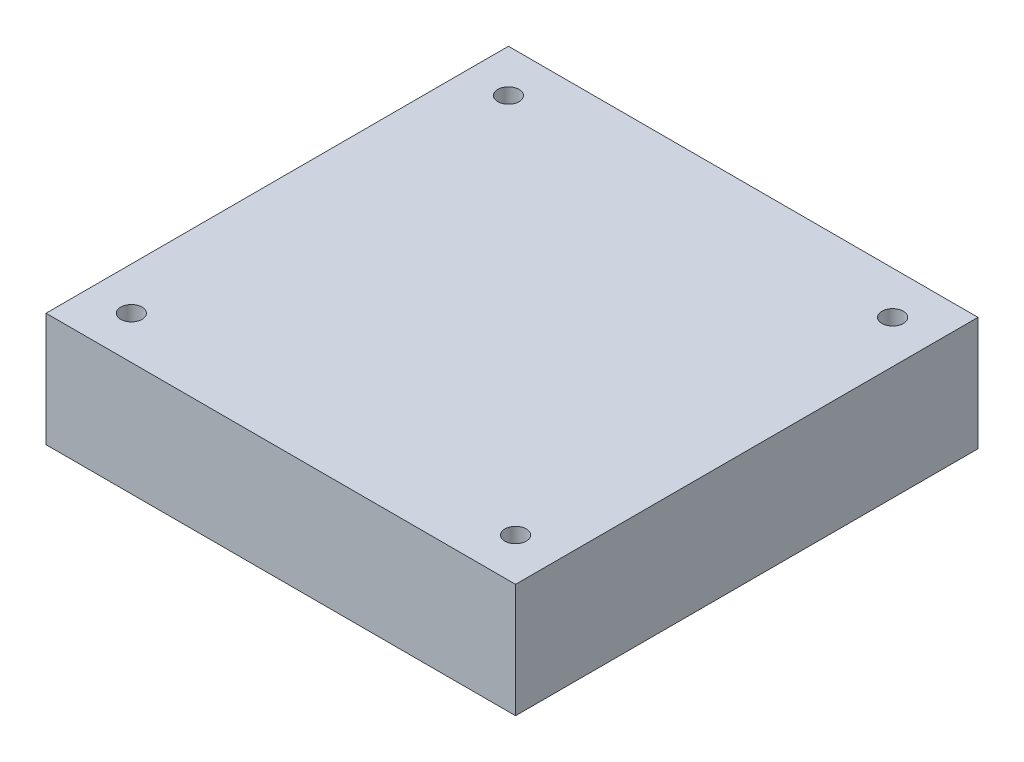
ISO-10303-21;
HEADER;
FILE_DESCRIPTION(('STEP AP214'),'2;1');
FILE_NAME('part.step','',(''),(''),'','','');
FILE_SCHEMA(('AUTOMOTIVE_DESIGN { 1 0 10303 214 1 1 1 1 }'));
ENDSEC;
DATA;
#1=APPLICATION_CONTEXT('core data for automotive mechanical design processes');
#2=APPLICATION_PROTOCOL_DEFINITION('international standard','automotive_design',2000,#1);
#3=PRODUCT_CONTEXT('',#1,'mechanical');
#4=PRODUCT('Part','Part','',(#3));
#5=PRODUCT_RELATED_PRODUCT_CATEGORY('part','',(#4));
#6=PRODUCT_DEFINITION_FORMATION('','',#4);
#7=PRODUCT_DEFINITION_CONTEXT('part definition',#1,'design');
#8=PRODUCT_DEFINITION('design','',#6,#7);
#9=PRODUCT_DEFINITION_SHAPE('','',#8);
#10=(LENGTH_UNIT() NAMED_UNIT(*) SI_UNIT(.MILLI.,.METRE.));
#11=(NAMED_UNIT(*) PLANE_ANGLE_UNIT() SI_UNIT($,.RADIAN.));
#12=(NAMED_UNIT(*) SI_UNIT($,.STERADIAN.) SOLID_ANGLE_UNIT());
#13=UNCERTAINTY_MEASURE_WITH_UNIT(LENGTH_MEASURE(1.E-05),#10,'distance_accuracy_value','');
#14=(GEOMETRIC_REPRESENTATION_CONTEXT(3) GLOBAL_UNCERTAINTY_ASSIGNED_CONTEXT((#13)) GLOBAL_UNIT_ASSIGNED_CONTEXT((#10,
#11,#12)) REPRESENTATION_CONTEXT('',''));
#15=CARTESIAN_POINT('',(0.,0.,0.));
#16=DIRECTION('',(0.,0.,1.));
#17=DIRECTION('',(1.,0.,0.));
#18=AXIS2_PLACEMENT_3D('',#15,#16,#17);
#19=CARTESIAN_POINT('',(33.,16.,-32.5));
#20=DIRECTION('',(-1.,0.,0.));
#21=DIRECTION('',(0.,0.,1.));
#22=AXIS2_PLACEMENT_3D('',#19,#20,#21);
#23=PLANE('',#22);
#24=DIRECTION('',(0.,0.,-1.));
#25=VECTOR('',#24,1.);
#26=CARTESIAN_POINT('',(33.,0.,-32.5));
#27=LINE('',#26,#25);
#28=CARTESIAN_POINT('',(33.,0.,32.5));
#29=VERTEX_POINT('',#28);
#30=CARTESIAN_POINT('',(33.,0.,-32.5));
#31=VERTEX_POINT('',#30);
#32=EDGE_CURVE('E96',#29,#31,#27,.T.);
#33=ORIENTED_EDGE('',*,*,#32,.T.);
#34=DIRECTION('',(0.,-1.,0.));
#35=VECTOR('',#34,1.);
#36=CARTESIAN_POINT('',(33.,16.,-32.5));
#37=LINE('',#36,#35);
#38=CARTESIAN_POINT('',(33.,16.,-32.5));
#39=VERTEX_POINT('',#38);
#40=EDGE_CURVE('E11',#39,#31,#37,.T.);
#41=ORIENTED_EDGE('',*,*,#40,.F.);
#42=DIRECTION('',(0.,0.,-1.));
#43=VECTOR('',#42,1.);
#44=CARTESIAN_POINT('',(33.,16.,-32.5));
#45=LINE('',#44,#43);
#46=CARTESIAN_POINT('',(33.,16.,32.5));
#47=VERTEX_POINT('',#46);
#48=EDGE_CURVE('E84',#47,#39,#45,.T.);
#49=ORIENTED_EDGE('',*,*,#48,.F.);
#50=DIRECTION('',(0.,-1.,0.));
#51=VECTOR('',#50,1.);
#52=CARTESIAN_POINT('',(33.,16.,32.5));
#53=LINE('',#52,#51);
#54=EDGE_CURVE('E92',#47,#29,#53,.T.);
#55=ORIENTED_EDGE('',*,*,#54,.T.);
#56=EDGE_LOOP('',(#33,#41,#49,#55));
#57=FACE_BOUND('',#56,.T.);
#58=ADVANCED_FACE('F33',(#57),#23,.F.);
#59=CARTESIAN_POINT('',(-33.,16.,-32.5));
#60=DIRECTION('',(0.,0.,1.));
#61=DIRECTION('',(1.,0.,0.));
#62=AXIS2_PLACEMENT_3D('',#59,#60,#61);
#63=PLANE('',#62);
#64=DIRECTION('',(-1.,0.,0.));
#65=VECTOR('',#64,1.);
#66=CARTESIAN_POINT('',(-33.,0.,-32.5));
#67=LINE('',#66,#65);
#68=CARTESIAN_POINT('',(-33.,0.,-32.5));
#69=VERTEX_POINT('',#68);
#70=EDGE_CURVE('E88',#31,#69,#67,.T.);
#71=ORIENTED_EDGE('',*,*,#70,.T.);
#72=DIRECTION('',(0.,-1.,0.));
#73=VECTOR('',#72,1.);
#74=CARTESIAN_POINT('',(-33.,16.,-32.5));
#75=LINE('',#74,#73);
#76=CARTESIAN_POINT('',(-33.,16.,-32.5));
#77=VERTEX_POINT('',#76);
#78=EDGE_CURVE('E41',#77,#69,#75,.T.);
#79=ORIENTED_EDGE('',*,*,#78,.F.);
#80=DIRECTION('',(-1.,0.,0.));
#81=VECTOR('',#80,1.);
#82=CARTESIAN_POINT('',(-33.,16.,-32.5));
#83=LINE('',#82,#81);
#84=EDGE_CURVE('E79',#39,#77,#83,.T.);
#85=ORIENTED_EDGE('',*,*,#84,.F.);
#86=ORIENTED_EDGE('',*,*,#40,.T.);
#87=EDGE_LOOP('',(#71,#79,#85,#86));
#88=FACE_BOUND('',#87,.T.);
#89=ADVANCED_FACE('F87',(#88),#63,.F.);
#90=CARTESIAN_POINT('',(-33.,16.,-32.5));
#91=DIRECTION('',(1.,0.,0.));
#92=DIRECTION('',(0.,0.,-1.));
#93=AXIS2_PLACEMENT_3D('',#90,#91,#92);
#94=PLANE('',#93);
#95=DIRECTION('',(0.,0.,1.));
#96=VECTOR('',#95,1.);
#97=CARTESIAN_POINT('',(-33.,0.,-32.5));
#98=LINE('',#97,#96);
#99=CARTESIAN_POINT('',(-33.,0.,32.5));
#100=VERTEX_POINT('',#99);
#101=EDGE_CURVE('E66',#69,#100,#98,.T.);
#102=ORIENTED_EDGE('',*,*,#101,.T.);
#103=DIRECTION('',(0.,-1.,0.));
#104=VECTOR('',#103,1.);
#105=CARTESIAN_POINT('',(-33.,16.,32.5));
#106=LINE('',#105,#104);
#107=CARTESIAN_POINT('',(-33.,16.,32.5));
#108=VERTEX_POINT('',#107);
#109=EDGE_CURVE('E89',#108,#100,#106,.T.);
#110=ORIENTED_EDGE('',*,*,#109,.F.);
#111=DIRECTION('',(0.,0.,1.));
#112=VECTOR('',#111,1.);
#113=CARTESIAN_POINT('',(-33.,16.,-32.5));
#114=LINE('',#113,#112);
#115=EDGE_CURVE('E82',#77,#108,#114,.T.);
#116=ORIENTED_EDGE('',*,*,#115,.F.);
#117=ORIENTED_EDGE('',*,*,#78,.T.);
#118=EDGE_LOOP('',(#102,#110,#116,#117));
#119=FACE_BOUND('',#118,.T.);
#120=ADVANCED_FACE('F90',(#119),#94,.F.);
#121=CARTESIAN_POINT('',(-33.,16.,32.5));
#122=DIRECTION('',(0.,0.,-1.));
#123=DIRECTION('',(-1.,0.,0.));
#124=AXIS2_PLACEMENT_3D('',#121,#122,#123);
#125=PLANE('',#124);
#126=DIRECTION('',(1.,0.,0.));
#127=VECTOR('',#126,1.);
#128=CARTESIAN_POINT('',(-33.,0.,32.5));
#129=LINE('',#128,#127);
#130=EDGE_CURVE('E72',#100,#29,#129,.T.);
#131=ORIENTED_EDGE('',*,*,#130,.T.);
#132=ORIENTED_EDGE('',*,*,#54,.F.);
#133=DIRECTION('',(1.,0.,0.));
#134=VECTOR('',#133,1.);
#135=CARTESIAN_POINT('',(-33.,16.,32.5));
#136=LINE('',#135,#134);
#137=EDGE_CURVE('E49',#108,#47,#136,.T.);
#138=ORIENTED_EDGE('',*,*,#137,.F.);
#139=ORIENTED_EDGE('',*,*,#109,.T.);
#140=EDGE_LOOP('',(#131,#132,#138,#139));
#141=FACE_BOUND('',#140,.T.);
#142=ADVANCED_FACE('F104',(#141),#125,.F.);
#143=CARTESIAN_POINT('',(0.,16.,0.));
#144=DIRECTION('',(0.,1.,0.));
#145=DIRECTION('',(0.,0.,1.));
#146=AXIS2_PLACEMENT_3D('',#143,#144,#145);
#147=PLANE('',#146);
#148=CARTESIAN_POINT('',(-27.,16.,26.5));
#149=DIRECTION('',(0.,1.,0.));
#150=DIRECTION('',(0.,0.,1.));
#151=AXIS2_PLACEMENT_3D('',#148,#149,#150);
#152=CIRCLE('',#151,1.5);
#153=CARTESIAN_POINT('',(-27.,16.,28.));
#154=VERTEX_POINT('',#153);
#155=EDGE_CURVE('E128',#154,#154,#152,.T.);
#156=ORIENTED_EDGE('',*,*,#155,.F.);
#157=EDGE_LOOP('',(#156));
#158=FACE_BOUND('',#157,.T.);
#159=CARTESIAN_POINT('',(27.,16.,26.5));
#160=DIRECTION('',(0.,1.,0.));
#161=DIRECTION('',(0.,0.,1.));
#162=AXIS2_PLACEMENT_3D('',#159,#160,#161);
#163=CIRCLE('',#162,1.5);
#164=CARTESIAN_POINT('',(27.,16.,28.));
#165=VERTEX_POINT('',#164);
#166=EDGE_CURVE('E122',#165,#165,#163,.T.);
#167=ORIENTED_EDGE('',*,*,#166,.F.);
#168=EDGE_LOOP('',(#167));
#169=FACE_BOUND('',#168,.T.);
#170=CARTESIAN_POINT('',(27.,16.,-26.5));
#171=DIRECTION('',(0.,1.,0.));
#172=DIRECTION('',(0.,0.,1.));
#173=AXIS2_PLACEMENT_3D('',#170,#171,#172);
#174=CIRCLE('',#173,1.5);
#175=CARTESIAN_POINT('',(27.,16.,-25.));
#176=VERTEX_POINT('',#175);
#177=EDGE_CURVE('E116',#176,#176,#174,.T.);
#178=ORIENTED_EDGE('',*,*,#177,.F.);
#179=EDGE_LOOP('',(#178));
#180=FACE_BOUND('',#179,.T.);
#181=CARTESIAN_POINT('',(-27.,16.,-26.5));
#182=DIRECTION('',(0.,1.,0.));
#183=DIRECTION('',(0.,0.,1.));
#184=AXIS2_PLACEMENT_3D('',#181,#182,#183);
#185=CIRCLE('',#184,1.5);
#186=CARTESIAN_POINT('',(-27.,16.,-25.));
#187=VERTEX_POINT('',#186);
#188=EDGE_CURVE('E110',#187,#187,#185,.T.);
#189=ORIENTED_EDGE('',*,*,#188,.F.);
#190=EDGE_LOOP('',(#189));
#191=FACE_BOUND('',#190,.T.);
#192=ORIENTED_EDGE('',*,*,#48,.T.);
#193=ORIENTED_EDGE('',*,*,#84,.T.);
#194=ORIENTED_EDGE('',*,*,#115,.T.);
#195=ORIENTED_EDGE('',*,*,#137,.T.);
#196=EDGE_LOOP('',(#192,#193,#194,#195));
#197=FACE_BOUND('',#196,.T.);
#198=ADVANCED_FACE('F80',(#158,#169,#180,#191,#197),#147,.T.);
#199=CARTESIAN_POINT('',(0.,0.,0.));
#200=DIRECTION('',(0.,1.,0.));
#201=DIRECTION('',(0.,0.,1.));
#202=AXIS2_PLACEMENT_3D('',#199,#200,#201);
#203=PLANE('',#202);
#204=CARTESIAN_POINT('',(-27.,0.,26.5));
#205=DIRECTION('',(0.,1.,0.));
#206=DIRECTION('',(0.,0.,1.));
#207=AXIS2_PLACEMENT_3D('',#204,#205,#206);
#208=CIRCLE('',#207,1.5);
#209=CARTESIAN_POINT('',(-27.,0.,28.));
#210=VERTEX_POINT('',#209);
#211=EDGE_CURVE('E125',#210,#210,#208,.T.);
#212=ORIENTED_EDGE('',*,*,#211,.T.);
#213=EDGE_LOOP('',(#212));
#214=FACE_BOUND('',#213,.T.);
#215=CARTESIAN_POINT('',(27.,0.,26.5));
#216=DIRECTION('',(0.,1.,0.));
#217=DIRECTION('',(0.,0.,1.));
#218=AXIS2_PLACEMENT_3D('',#215,#216,#217);
#219=CIRCLE('',#218,1.5);
#220=CARTESIAN_POINT('',(27.,0.,28.));
#221=VERTEX_POINT('',#220);
#222=EDGE_CURVE('E119',#221,#221,#219,.T.);
#223=ORIENTED_EDGE('',*,*,#222,.T.);
#224=EDGE_LOOP('',(#223));
#225=FACE_BOUND('',#224,.T.);
#226=CARTESIAN_POINT('',(27.,0.,-26.5));
#227=DIRECTION('',(0.,1.,0.));
#228=DIRECTION('',(0.,0.,1.));
#229=AXIS2_PLACEMENT_3D('',#226,#227,#228);
#230=CIRCLE('',#229,1.5);
#231=CARTESIAN_POINT('',(27.,0.,-25.));
#232=VERTEX_POINT('',#231);
#233=EDGE_CURVE('E113',#232,#232,#230,.T.);
#234=ORIENTED_EDGE('',*,*,#233,.T.);
#235=EDGE_LOOP('',(#234));
#236=FACE_BOUND('',#235,.T.);
#237=CARTESIAN_POINT('',(-27.,0.,-26.5));
#238=DIRECTION('',(0.,1.,0.));
#239=DIRECTION('',(0.,0.,1.));
#240=AXIS2_PLACEMENT_3D('',#237,#238,#239);
#241=CIRCLE('',#240,1.5);
#242=CARTESIAN_POINT('',(-27.,0.,-25.));
#243=VERTEX_POINT('',#242);
#244=EDGE_CURVE('E99',#243,#243,#241,.T.);
#245=ORIENTED_EDGE('',*,*,#244,.T.);
#246=EDGE_LOOP('',(#245));
#247=FACE_BOUND('',#246,.T.);
#248=ORIENTED_EDGE('',*,*,#32,.F.);
#249=ORIENTED_EDGE('',*,*,#130,.F.);
#250=ORIENTED_EDGE('',*,*,#101,.F.);
#251=ORIENTED_EDGE('',*,*,#70,.F.);
#252=EDGE_LOOP('',(#248,#249,#250,#251));
#253=FACE_BOUND('',#252,.T.);
#254=ADVANCED_FACE('F107',(#214,#225,#236,#247,#253),#203,.F.);
#255=CARTESIAN_POINT('',(-27.,0.,-26.5));
#256=DIRECTION('',(0.,1.,0.));
#257=DIRECTION('',(0.,0.,1.));
#258=AXIS2_PLACEMENT_3D('',#255,#256,#257);
#259=CYLINDRICAL_SURFACE('',#258,1.5);
#260=ORIENTED_EDGE('',*,*,#244,.F.);
#261=EDGE_LOOP('',(#260));
#262=FACE_BOUND('',#261,.T.);
#263=ORIENTED_EDGE('',*,*,#188,.T.);
#264=EDGE_LOOP('',(#263));
#265=FACE_BOUND('',#264,.T.);
#266=ADVANCED_FACE('F152',(#262,#265),#259,.F.);
#267=CARTESIAN_POINT('',(27.,0.,-26.5));
#268=DIRECTION('',(0.,1.,0.));
#269=DIRECTION('',(0.,0.,1.));
#270=AXIS2_PLACEMENT_3D('',#267,#268,#269);
#271=CYLINDRICAL_SURFACE('',#270,1.5);
#272=ORIENTED_EDGE('',*,*,#233,.F.);
#273=EDGE_LOOP('',(#272));
#274=FACE_BOUND('',#273,.T.);
#275=ORIENTED_EDGE('',*,*,#177,.T.);
#276=EDGE_LOOP('',(#275));
#277=FACE_BOUND('',#276,.T.);
#278=ADVANCED_FACE('F154',(#274,#277),#271,.F.);
#279=CARTESIAN_POINT('',(27.,0.,26.5));
#280=DIRECTION('',(0.,1.,0.));
#281=DIRECTION('',(0.,0.,1.));
#282=AXIS2_PLACEMENT_3D('',#279,#280,#281);
#283=CYLINDRICAL_SURFACE('',#282,1.5);
#284=ORIENTED_EDGE('',*,*,#222,.F.);
#285=EDGE_LOOP('',(#284));
#286=FACE_BOUND('',#285,.T.);
#287=ORIENTED_EDGE('',*,*,#166,.T.);
#288=EDGE_LOOP('',(#287));
#289=FACE_BOUND('',#288,.T.);
#290=ADVANCED_FACE('F139',(#286,#289),#283,.F.);
#291=CARTESIAN_POINT('',(-27.,0.,26.5));
#292=DIRECTION('',(0.,1.,0.));
#293=DIRECTION('',(0.,0.,1.));
#294=AXIS2_PLACEMENT_3D('',#291,#292,#293);
#295=CYLINDRICAL_SURFACE('',#294,1.5);
#296=ORIENTED_EDGE('',*,*,#211,.F.);
#297=EDGE_LOOP('',(#296));
#298=FACE_BOUND('',#297,.T.);
#299=ORIENTED_EDGE('',*,*,#155,.T.);
#300=EDGE_LOOP('',(#299));
#301=FACE_BOUND('',#300,.T.);
#302=ADVANCED_FACE('F136',(#298,#301),#295,.F.);
#303=CLOSED_SHELL('',(#58,#89,#120,#142,#198,#254,#266,#278,#290,#302));
#304=MANIFOLD_SOLID_BREP('B2',#303);
#305=ADVANCED_BREP_SHAPE_REPRESENTATION('',(#18,#304),#14);
#306=SHAPE_DEFINITION_REPRESENTATION(#9,#305);
ENDSEC;
END-ISO-10303-21;
